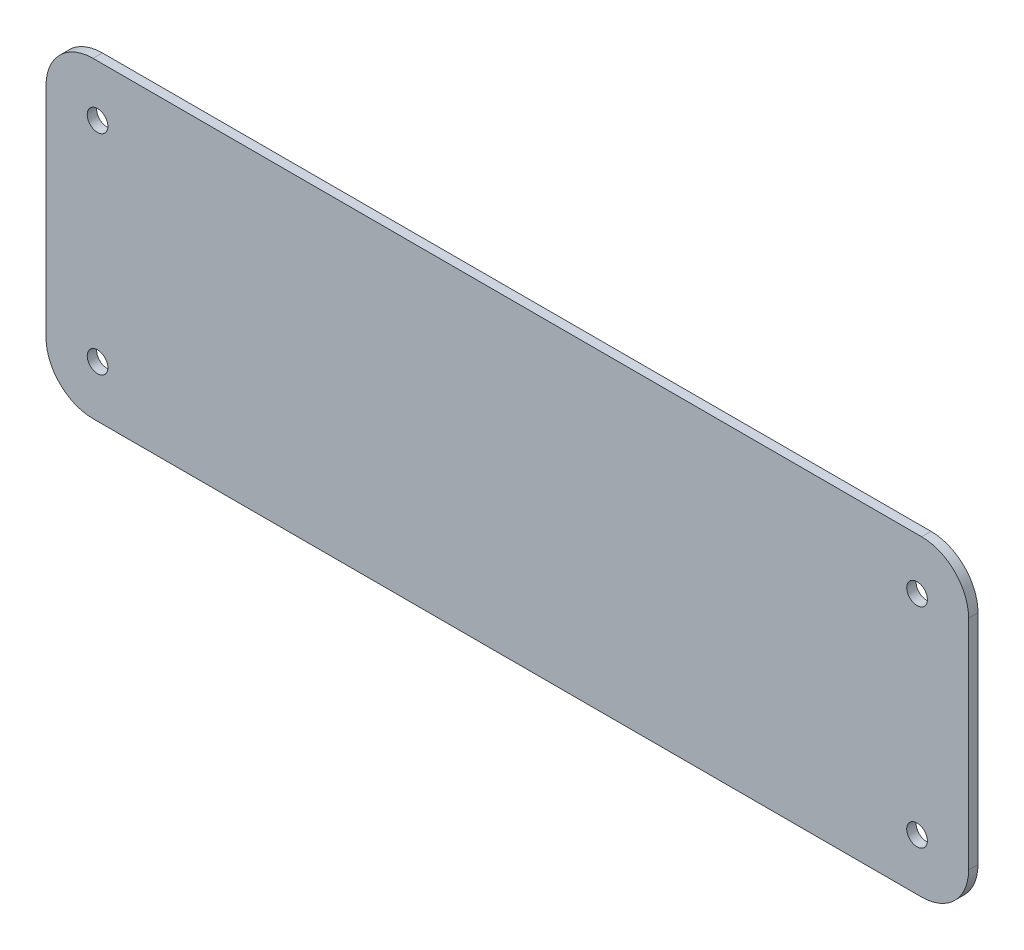
ISO-10303-21;
HEADER;
FILE_DESCRIPTION(('STEP AP214'),'2;1');
FILE_NAME('part.step','',(''),(''),'','','');
FILE_SCHEMA(('AUTOMOTIVE_DESIGN { 1 0 10303 214 1 1 1 1 }'));
ENDSEC;
DATA;
#1=APPLICATION_CONTEXT('core data for automotive mechanical design processes');
#2=APPLICATION_PROTOCOL_DEFINITION('international standard','automotive_design',2000,#1);
#3=PRODUCT_CONTEXT('',#1,'mechanical');
#4=PRODUCT('Part','Part','',(#3));
#5=PRODUCT_RELATED_PRODUCT_CATEGORY('part','',(#4));
#6=PRODUCT_DEFINITION_FORMATION('','',#4);
#7=PRODUCT_DEFINITION_CONTEXT('part definition',#1,'design');
#8=PRODUCT_DEFINITION('design','',#6,#7);
#9=PRODUCT_DEFINITION_SHAPE('','',#8);
#10=(LENGTH_UNIT() NAMED_UNIT(*) SI_UNIT(.MILLI.,.METRE.));
#11=(NAMED_UNIT(*) PLANE_ANGLE_UNIT() SI_UNIT($,.RADIAN.));
#12=(NAMED_UNIT(*) SI_UNIT($,.STERADIAN.) SOLID_ANGLE_UNIT());
#13=UNCERTAINTY_MEASURE_WITH_UNIT(LENGTH_MEASURE(1.E-05),#10,'distance_accuracy_value','');
#14=(GEOMETRIC_REPRESENTATION_CONTEXT(3) GLOBAL_UNCERTAINTY_ASSIGNED_CONTEXT((#13)) GLOBAL_UNIT_ASSIGNED_CONTEXT((#10,
#11,#12)) REPRESENTATION_CONTEXT('',''));
#15=CARTESIAN_POINT('',(0.,0.,0.));
#16=DIRECTION('',(0.,0.,1.));
#17=DIRECTION('',(1.,0.,0.));
#18=AXIS2_PLACEMENT_3D('',#15,#16,#17);
#19=CARTESIAN_POINT('',(92.838694437389,27.864808229616,-8.));
#20=DIRECTION('',(0.,0.,-1.));
#21=DIRECTION('',(-1.,0.,0.));
#22=AXIS2_PLACEMENT_3D('',#19,#20,#21);
#23=PLANE('',#22);
#24=CARTESIAN_POINT('',(5.140210820422,27.377655575311,-8.));
#25=DIRECTION('',(0.,0.,-1.));
#26=DIRECTION('',(-1.,0.,0.));
#27=AXIS2_PLACEMENT_3D('',#24,#25,#26);
#28=CIRCLE('',#27,1.100002540005);
#29=CARTESIAN_POINT('',(4.040208280417,27.377655575311,-8.));
#30=VERTEX_POINT('',#29);
#31=EDGE_CURVE('E194',#30,#30,#28,.T.);
#32=ORIENTED_EDGE('',*,*,#31,.F.);
#33=EDGE_LOOP('',(#32));
#34=FACE_BOUND('',#33,.T.);
#35=CARTESIAN_POINT('',(92.351384302769,27.377498094996,-8.));
#36=DIRECTION('',(0.,0.,-1.));
#37=DIRECTION('',(-1.,0.,0.));
#38=AXIS2_PLACEMENT_3D('',#35,#36,#37);
#39=CIRCLE('',#38,1.10000254000502);
#40=CARTESIAN_POINT('',(91.251381762764,27.377498094996,-8.));
#41=VERTEX_POINT('',#40);
#42=EDGE_CURVE('E140',#41,#41,#39,.T.);
#43=ORIENTED_EDGE('',*,*,#42,.F.);
#44=EDGE_LOOP('',(#43));
#45=FACE_BOUND('',#44,.T.);
#46=DIRECTION('',(1.,0.,0.));
#47=VECTOR('',#46,1.);
#48=CARTESIAN_POINT('',(4.652900685801,32.864808229616,-8.));
#49=LINE('',#48,#47);
#50=CARTESIAN_POINT('',(4.65290068580103,32.864808229616,-8.));
#51=VERTEX_POINT('',#50);
#52=CARTESIAN_POINT('',(92.838694437389,32.864808229616,-8.));
#53=VERTEX_POINT('',#52);
#54=EDGE_CURVE('E151',#51,#53,#49,.T.);
#55=ORIENTED_EDGE('',*,*,#54,.T.);
#56=CARTESIAN_POINT('',(92.838694437389,27.864808229616,-8.));
#57=DIRECTION('',(0.,0.,-1.));
#58=DIRECTION('',(-1.,0.,0.));
#59=AXIS2_PLACEMENT_3D('',#56,#57,#58);
#60=CIRCLE('',#59,5.);
#61=CARTESIAN_POINT('',(97.838694437389,27.864808229616,-8.));
#62=VERTEX_POINT('',#61);
#63=EDGE_CURVE('E99',#53,#62,#60,.T.);
#64=ORIENTED_EDGE('',*,*,#63,.T.);
#65=DIRECTION('',(0.,-1.,0.));
#66=VECTOR('',#65,1.);
#67=CARTESIAN_POINT('',(97.838694437389,27.864808229616,-8.));
#68=LINE('',#67,#66);
#69=CARTESIAN_POINT('',(97.838694437389,4.65351536703104,-8.));
#70=VERTEX_POINT('',#69);
#71=EDGE_CURVE('E166',#62,#70,#68,.T.);
#72=ORIENTED_EDGE('',*,*,#71,.T.);
#73=CARTESIAN_POINT('',(92.838694437389,4.653515367031,-8.));
#74=DIRECTION('',(0.,0.,-1.));
#75=DIRECTION('',(-1.,0.,0.));
#76=AXIS2_PLACEMENT_3D('',#73,#74,#75);
#77=CIRCLE('',#76,5.);
#78=CARTESIAN_POINT('',(92.838694437389,-0.346484632969002,-8.));
#79=VERTEX_POINT('',#78);
#80=EDGE_CURVE('E179',#70,#79,#77,.T.);
#81=ORIENTED_EDGE('',*,*,#80,.T.);
#82=DIRECTION('',(-1.,0.,0.));
#83=VECTOR('',#82,1.);
#84=CARTESIAN_POINT('',(4.652900685801,-0.346484632969001,-8.));
#85=LINE('',#84,#83);
#86=CARTESIAN_POINT('',(4.65290068580104,-0.346484632968999,-8.));
#87=VERTEX_POINT('',#86);
#88=EDGE_CURVE('E118',#79,#87,#85,.T.);
#89=ORIENTED_EDGE('',*,*,#88,.T.);
#90=CARTESIAN_POINT('',(4.652900685801,4.653515367031,-8.));
#91=DIRECTION('',(0.,0.,-1.));
#92=DIRECTION('',(-1.,0.,0.));
#93=AXIS2_PLACEMENT_3D('',#90,#91,#92);
#94=CIRCLE('',#93,5.);
#95=CARTESIAN_POINT('',(-0.347099314199004,4.653515367031,-8.));
#96=VERTEX_POINT('',#95);
#97=EDGE_CURVE('E112',#87,#96,#94,.T.);
#98=ORIENTED_EDGE('',*,*,#97,.T.);
#99=DIRECTION('',(0.,1.,0.));
#100=VECTOR('',#99,1.);
#101=CARTESIAN_POINT('',(-0.347099314199004,27.864808229616,-8.));
#102=LINE('',#101,#100);
#103=CARTESIAN_POINT('',(-0.347099314199005,27.864808229616,-8.));
#104=VERTEX_POINT('',#103);
#105=EDGE_CURVE('E116',#96,#104,#102,.T.);
#106=ORIENTED_EDGE('',*,*,#105,.T.);
#107=CARTESIAN_POINT('',(4.652900685801,27.864808229616,-8.));
#108=DIRECTION('',(0.,0.,-1.));
#109=DIRECTION('',(-1.,0.,0.));
#110=AXIS2_PLACEMENT_3D('',#107,#108,#109);
#111=CIRCLE('',#110,5.);
#112=EDGE_CURVE('E56',#104,#51,#111,.T.);
#113=ORIENTED_EDGE('',*,*,#112,.T.);
#114=EDGE_LOOP('',(#55,#64,#72,#81,#89,#98,#106,#113));
#115=FACE_BOUND('',#114,.T.);
#116=CARTESIAN_POINT('',(92.351384302769,5.140825501651,-8.));
#117=DIRECTION('',(0.,0.,-1.));
#118=DIRECTION('',(-1.,0.,0.));
#119=AXIS2_PLACEMENT_3D('',#116,#117,#118);
#120=CIRCLE('',#119,1.10000254000502);
#121=CARTESIAN_POINT('',(91.251381762764,5.140825501651,-8.));
#122=VERTEX_POINT('',#121);
#123=EDGE_CURVE('E188',#122,#122,#120,.T.);
#124=ORIENTED_EDGE('',*,*,#123,.F.);
#125=EDGE_LOOP('',(#124));
#126=FACE_BOUND('',#125,.T.);
#127=CARTESIAN_POINT('',(5.140210820422,5.140609601219,-8.));
#128=DIRECTION('',(0.,0.,-1.));
#129=DIRECTION('',(-1.,0.,0.));
#130=AXIS2_PLACEMENT_3D('',#127,#128,#129);
#131=CIRCLE('',#130,1.100002540005);
#132=CARTESIAN_POINT('',(4.040208280417,5.140609601219,-8.));
#133=VERTEX_POINT('',#132);
#134=EDGE_CURVE('E200',#133,#133,#131,.T.);
#135=ORIENTED_EDGE('',*,*,#134,.F.);
#136=EDGE_LOOP('',(#135));
#137=FACE_BOUND('',#136,.T.);
#138=ADVANCED_FACE('F39',(#34,#45,#115,#126,#137),#23,.T.);
#139=CARTESIAN_POINT('',(92.838694437389,27.864808229616,-7.));
#140=DIRECTION('',(0.,0.,-1.));
#141=DIRECTION('',(-1.,0.,0.));
#142=AXIS2_PLACEMENT_3D('',#139,#140,#141);
#143=PLANE('',#142);
#144=DIRECTION('',(1.,0.,0.));
#145=VECTOR('',#144,1.);
#146=CARTESIAN_POINT('',(4.652900685801,32.864808229616,-7.));
#147=LINE('',#146,#145);
#148=CARTESIAN_POINT('',(4.65290068580103,32.864808229616,-7.));
#149=VERTEX_POINT('',#148);
#150=CARTESIAN_POINT('',(92.838694437389,32.864808229616,-7.));
#151=VERTEX_POINT('',#150);
#152=EDGE_CURVE('E136',#149,#151,#147,.T.);
#153=ORIENTED_EDGE('',*,*,#152,.F.);
#154=CARTESIAN_POINT('',(4.652900685801,27.864808229616,-7.));
#155=DIRECTION('',(0.,0.,-1.));
#156=DIRECTION('',(-1.,0.,0.));
#157=AXIS2_PLACEMENT_3D('',#154,#155,#156);
#158=CIRCLE('',#157,5.);
#159=CARTESIAN_POINT('',(-0.347099314199005,27.864808229616,-7.));
#160=VERTEX_POINT('',#159);
#161=EDGE_CURVE('E91',#160,#149,#158,.T.);
#162=ORIENTED_EDGE('',*,*,#161,.F.);
#163=DIRECTION('',(0.,1.,0.));
#164=VECTOR('',#163,1.);
#165=CARTESIAN_POINT('',(-0.347099314199004,27.864808229616,-7.));
#166=LINE('',#165,#164);
#167=CARTESIAN_POINT('',(-0.347099314199004,4.653515367031,-7.));
#168=VERTEX_POINT('',#167);
#169=EDGE_CURVE('E85',#168,#160,#166,.T.);
#170=ORIENTED_EDGE('',*,*,#169,.F.);
#171=CARTESIAN_POINT('',(4.652900685801,4.653515367031,-7.));
#172=DIRECTION('',(0.,0.,-1.));
#173=DIRECTION('',(-1.,0.,0.));
#174=AXIS2_PLACEMENT_3D('',#171,#172,#173);
#175=CIRCLE('',#174,5.);
#176=CARTESIAN_POINT('',(4.65290068580104,-0.346484632968999,-7.));
#177=VERTEX_POINT('',#176);
#178=EDGE_CURVE('E126',#177,#168,#175,.T.);
#179=ORIENTED_EDGE('',*,*,#178,.F.);
#180=DIRECTION('',(-1.,0.,0.));
#181=VECTOR('',#180,1.);
#182=CARTESIAN_POINT('',(4.652900685801,-0.346484632969001,-7.));
#183=LINE('',#182,#181);
#184=CARTESIAN_POINT('',(92.838694437389,-0.346484632969002,-7.));
#185=VERTEX_POINT('',#184);
#186=EDGE_CURVE('E146',#185,#177,#183,.T.);
#187=ORIENTED_EDGE('',*,*,#186,.F.);
#188=CARTESIAN_POINT('',(92.838694437389,4.653515367031,-7.));
#189=DIRECTION('',(0.,0.,-1.));
#190=DIRECTION('',(-1.,0.,0.));
#191=AXIS2_PLACEMENT_3D('',#188,#189,#190);
#192=CIRCLE('',#191,5.);
#193=CARTESIAN_POINT('',(97.838694437389,4.65351536703104,-7.));
#194=VERTEX_POINT('',#193);
#195=EDGE_CURVE('E144',#194,#185,#192,.T.);
#196=ORIENTED_EDGE('',*,*,#195,.F.);
#197=DIRECTION('',(0.,-1.,0.));
#198=VECTOR('',#197,1.);
#199=CARTESIAN_POINT('',(97.838694437389,27.864808229616,-7.));
#200=LINE('',#199,#198);
#201=CARTESIAN_POINT('',(97.838694437389,27.864808229616,-7.));
#202=VERTEX_POINT('',#201);
#203=EDGE_CURVE('E142',#202,#194,#200,.T.);
#204=ORIENTED_EDGE('',*,*,#203,.F.);
#205=CARTESIAN_POINT('',(92.838694437389,27.864808229616,-7.));
#206=DIRECTION('',(0.,0.,-1.));
#207=DIRECTION('',(-1.,0.,0.));
#208=AXIS2_PLACEMENT_3D('',#205,#206,#207);
#209=CIRCLE('',#208,5.);
#210=EDGE_CURVE('E139',#151,#202,#209,.T.);
#211=ORIENTED_EDGE('',*,*,#210,.F.);
#212=EDGE_LOOP('',(#153,#162,#170,#179,#187,#196,#204,#211));
#213=FACE_BOUND('',#212,.T.);
#214=CARTESIAN_POINT('',(92.351384302769,27.377498094996,-7.));
#215=DIRECTION('',(0.,0.,-1.));
#216=DIRECTION('',(-1.,0.,0.));
#217=AXIS2_PLACEMENT_3D('',#214,#215,#216);
#218=CIRCLE('',#217,1.10000254000502);
#219=CARTESIAN_POINT('',(91.251381762764,27.377498094996,-7.));
#220=VERTEX_POINT('',#219);
#221=EDGE_CURVE('E185',#220,#220,#218,.T.);
#222=ORIENTED_EDGE('',*,*,#221,.T.);
#223=EDGE_LOOP('',(#222));
#224=FACE_BOUND('',#223,.T.);
#225=CARTESIAN_POINT('',(92.351384302769,5.140825501651,-7.));
#226=DIRECTION('',(0.,0.,-1.));
#227=DIRECTION('',(-1.,0.,0.));
#228=AXIS2_PLACEMENT_3D('',#225,#226,#227);
#229=CIRCLE('',#228,1.10000254000502);
#230=CARTESIAN_POINT('',(91.251381762764,5.140825501651,-7.));
#231=VERTEX_POINT('',#230);
#232=EDGE_CURVE('E191',#231,#231,#229,.T.);
#233=ORIENTED_EDGE('',*,*,#232,.T.);
#234=EDGE_LOOP('',(#233));
#235=FACE_BOUND('',#234,.T.);
#236=CARTESIAN_POINT('',(5.140210820422,27.377655575311,-7.));
#237=DIRECTION('',(0.,0.,-1.));
#238=DIRECTION('',(-1.,0.,0.));
#239=AXIS2_PLACEMENT_3D('',#236,#237,#238);
#240=CIRCLE('',#239,1.100002540005);
#241=CARTESIAN_POINT('',(4.040208280417,27.377655575311,-7.));
#242=VERTEX_POINT('',#241);
#243=EDGE_CURVE('E197',#242,#242,#240,.T.);
#244=ORIENTED_EDGE('',*,*,#243,.T.);
#245=EDGE_LOOP('',(#244));
#246=FACE_BOUND('',#245,.T.);
#247=CARTESIAN_POINT('',(5.140210820422,5.140609601219,-7.));
#248=DIRECTION('',(0.,0.,-1.));
#249=DIRECTION('',(-1.,0.,0.));
#250=AXIS2_PLACEMENT_3D('',#247,#248,#249);
#251=CIRCLE('',#250,1.100002540005);
#252=CARTESIAN_POINT('',(4.040208280417,5.140609601219,-7.));
#253=VERTEX_POINT('',#252);
#254=EDGE_CURVE('E203',#253,#253,#251,.T.);
#255=ORIENTED_EDGE('',*,*,#254,.T.);
#256=EDGE_LOOP('',(#255));
#257=FACE_BOUND('',#256,.T.);
#258=ADVANCED_FACE('F170',(#213,#224,#235,#246,#257),#143,.F.);
#259=CARTESIAN_POINT('',(4.652900685801,32.864808229616,-8.));
#260=DIRECTION('',(0.,-1.,0.));
#261=DIRECTION('',(0.,0.,-1.));
#262=AXIS2_PLACEMENT_3D('',#259,#260,#261);
#263=PLANE('',#262);
#264=ORIENTED_EDGE('',*,*,#152,.T.);
#265=DIRECTION('',(0.,0.,1.));
#266=VECTOR('',#265,1.);
#267=CARTESIAN_POINT('',(92.838694437389,32.864808229616,-8.));
#268=LINE('',#267,#266);
#269=EDGE_CURVE('E11',#53,#151,#268,.T.);
#270=ORIENTED_EDGE('',*,*,#269,.F.);
#271=ORIENTED_EDGE('',*,*,#54,.F.);
#272=DIRECTION('',(0.,0.,1.));
#273=VECTOR('',#272,1.);
#274=CARTESIAN_POINT('',(4.65290068580103,32.864808229616,-8.));
#275=LINE('',#274,#273);
#276=EDGE_CURVE('E132',#51,#149,#275,.T.);
#277=ORIENTED_EDGE('',*,*,#276,.T.);
#278=EDGE_LOOP('',(#264,#270,#271,#277));
#279=FACE_BOUND('',#278,.T.);
#280=ADVANCED_FACE('F41',(#279),#263,.F.);
#281=CARTESIAN_POINT('',(92.838694437389,27.864808229616,-8.));
#282=DIRECTION('',(0.,0.,1.));
#283=DIRECTION('',(1.,0.,0.));
#284=AXIS2_PLACEMENT_3D('',#281,#282,#283);
#285=CYLINDRICAL_SURFACE('',#284,5.);
#286=ORIENTED_EDGE('',*,*,#210,.T.);
#287=DIRECTION('',(0.,0.,1.));
#288=VECTOR('',#287,1.);
#289=CARTESIAN_POINT('',(97.838694437389,27.864808229616,-8.));
#290=LINE('',#289,#288);
#291=EDGE_CURVE('E48',#62,#202,#290,.T.);
#292=ORIENTED_EDGE('',*,*,#291,.F.);
#293=ORIENTED_EDGE('',*,*,#63,.F.);
#294=ORIENTED_EDGE('',*,*,#269,.T.);
#295=EDGE_LOOP('',(#286,#292,#293,#294));
#296=FACE_BOUND('',#295,.T.);
#297=ADVANCED_FACE('F237',(#296),#285,.T.);
#298=CARTESIAN_POINT('',(97.838694437389,27.864808229616,-8.));
#299=DIRECTION('',(-1.,0.,0.));
#300=DIRECTION('',(0.,0.,1.));
#301=AXIS2_PLACEMENT_3D('',#298,#299,#300);
#302=PLANE('',#301);
#303=ORIENTED_EDGE('',*,*,#203,.T.);
#304=DIRECTION('',(0.,0.,1.));
#305=VECTOR('',#304,1.);
#306=CARTESIAN_POINT('',(97.838694437389,4.65351536703104,-8.));
#307=LINE('',#306,#305);
#308=EDGE_CURVE('E158',#70,#194,#307,.T.);
#309=ORIENTED_EDGE('',*,*,#308,.F.);
#310=ORIENTED_EDGE('',*,*,#71,.F.);
#311=ORIENTED_EDGE('',*,*,#291,.T.);
#312=EDGE_LOOP('',(#303,#309,#310,#311));
#313=FACE_BOUND('',#312,.T.);
#314=ADVANCED_FACE('F164',(#313),#302,.F.);
#315=CARTESIAN_POINT('',(92.838694437389,4.653515367031,-8.));
#316=DIRECTION('',(0.,0.,1.));
#317=DIRECTION('',(1.,0.,0.));
#318=AXIS2_PLACEMENT_3D('',#315,#316,#317);
#319=CYLINDRICAL_SURFACE('',#318,5.);
#320=ORIENTED_EDGE('',*,*,#195,.T.);
#321=DIRECTION('',(0.,0.,1.));
#322=VECTOR('',#321,1.);
#323=CARTESIAN_POINT('',(92.838694437389,-0.346484632969002,-8.));
#324=LINE('',#323,#322);
#325=EDGE_CURVE('E155',#79,#185,#324,.T.);
#326=ORIENTED_EDGE('',*,*,#325,.F.);
#327=ORIENTED_EDGE('',*,*,#80,.F.);
#328=ORIENTED_EDGE('',*,*,#308,.T.);
#329=EDGE_LOOP('',(#320,#326,#327,#328));
#330=FACE_BOUND('',#329,.T.);
#331=ADVANCED_FACE('F175',(#330),#319,.T.);
#332=CARTESIAN_POINT('',(4.652900685801,-0.346484632969001,-8.));
#333=DIRECTION('',(0.,1.,0.));
#334=DIRECTION('',(-1.,0.,0.));
#335=AXIS2_PLACEMENT_3D('',#332,#333,#334);
#336=PLANE('',#335);
#337=ORIENTED_EDGE('',*,*,#186,.T.);
#338=DIRECTION('',(0.,0.,1.));
#339=VECTOR('',#338,1.);
#340=CARTESIAN_POINT('',(4.65290068580104,-0.346484632968999,-8.));
#341=LINE('',#340,#339);
#342=EDGE_CURVE('E127',#87,#177,#341,.T.);
#343=ORIENTED_EDGE('',*,*,#342,.F.);
#344=ORIENTED_EDGE('',*,*,#88,.F.);
#345=ORIENTED_EDGE('',*,*,#325,.T.);
#346=EDGE_LOOP('',(#337,#343,#344,#345));
#347=FACE_BOUND('',#346,.T.);
#348=ADVANCED_FACE('F178',(#347),#336,.F.);
#349=CARTESIAN_POINT('',(4.652900685801,4.653515367031,-8.));
#350=DIRECTION('',(0.,0.,1.));
#351=DIRECTION('',(1.,0.,0.));
#352=AXIS2_PLACEMENT_3D('',#349,#350,#351);
#353=CYLINDRICAL_SURFACE('',#352,5.);
#354=ORIENTED_EDGE('',*,*,#178,.T.);
#355=DIRECTION('',(0.,0.,1.));
#356=VECTOR('',#355,1.);
#357=CARTESIAN_POINT('',(-0.347099314199004,4.653515367031,-8.));
#358=LINE('',#357,#356);
#359=EDGE_CURVE('E123',#96,#168,#358,.T.);
#360=ORIENTED_EDGE('',*,*,#359,.F.);
#361=ORIENTED_EDGE('',*,*,#97,.F.);
#362=ORIENTED_EDGE('',*,*,#342,.T.);
#363=EDGE_LOOP('',(#354,#360,#361,#362));
#364=FACE_BOUND('',#363,.T.);
#365=ADVANCED_FACE('F124',(#364),#353,.T.);
#366=CARTESIAN_POINT('',(-0.347099314199004,27.864808229616,-8.));
#367=DIRECTION('',(1.,0.,0.));
#368=DIRECTION('',(0.,0.,-1.));
#369=AXIS2_PLACEMENT_3D('',#366,#367,#368);
#370=PLANE('',#369);
#371=ORIENTED_EDGE('',*,*,#169,.T.);
#372=DIRECTION('',(0.,0.,1.));
#373=VECTOR('',#372,1.);
#374=CARTESIAN_POINT('',(-0.347099314199005,27.864808229616,-8.));
#375=LINE('',#374,#373);
#376=EDGE_CURVE('E128',#104,#160,#375,.T.);
#377=ORIENTED_EDGE('',*,*,#376,.F.);
#378=ORIENTED_EDGE('',*,*,#105,.F.);
#379=ORIENTED_EDGE('',*,*,#359,.T.);
#380=EDGE_LOOP('',(#371,#377,#378,#379));
#381=FACE_BOUND('',#380,.T.);
#382=ADVANCED_FACE('F130',(#381),#370,.F.);
#383=CARTESIAN_POINT('',(4.652900685801,27.864808229616,-8.));
#384=DIRECTION('',(0.,0.,1.));
#385=DIRECTION('',(1.,0.,0.));
#386=AXIS2_PLACEMENT_3D('',#383,#384,#385);
#387=CYLINDRICAL_SURFACE('',#386,5.);
#388=ORIENTED_EDGE('',*,*,#161,.T.);
#389=ORIENTED_EDGE('',*,*,#276,.F.);
#390=ORIENTED_EDGE('',*,*,#112,.F.);
#391=ORIENTED_EDGE('',*,*,#376,.T.);
#392=EDGE_LOOP('',(#388,#389,#390,#391));
#393=FACE_BOUND('',#392,.T.);
#394=ADVANCED_FACE('F225',(#393),#387,.T.);
#395=CARTESIAN_POINT('',(92.351384302769,27.377498094996,-8.));
#396=DIRECTION('',(0.,0.,1.));
#397=DIRECTION('',(1.,0.,0.));
#398=AXIS2_PLACEMENT_3D('',#395,#396,#397);
#399=CYLINDRICAL_SURFACE('',#398,1.10000254000502);
#400=ORIENTED_EDGE('',*,*,#42,.T.);
#401=EDGE_LOOP('',(#400));
#402=FACE_BOUND('',#401,.T.);
#403=ORIENTED_EDGE('',*,*,#221,.F.);
#404=EDGE_LOOP('',(#403));
#405=FACE_BOUND('',#404,.T.);
#406=ADVANCED_FACE('F222',(#402,#405),#399,.F.);
#407=CARTESIAN_POINT('',(92.351384302769,5.140825501651,-8.));
#408=DIRECTION('',(0.,0.,1.));
#409=DIRECTION('',(1.,0.,0.));
#410=AXIS2_PLACEMENT_3D('',#407,#408,#409);
#411=CYLINDRICAL_SURFACE('',#410,1.10000254000502);
#412=ORIENTED_EDGE('',*,*,#123,.T.);
#413=EDGE_LOOP('',(#412));
#414=FACE_BOUND('',#413,.T.);
#415=ORIENTED_EDGE('',*,*,#232,.F.);
#416=EDGE_LOOP('',(#415));
#417=FACE_BOUND('',#416,.T.);
#418=ADVANCED_FACE('F313',(#414,#417),#411,.F.);
#419=CARTESIAN_POINT('',(5.140210820422,27.377655575311,-8.));
#420=DIRECTION('',(0.,0.,1.));
#421=DIRECTION('',(1.,0.,0.));
#422=AXIS2_PLACEMENT_3D('',#419,#420,#421);
#423=CYLINDRICAL_SURFACE('',#422,1.100002540005);
#424=ORIENTED_EDGE('',*,*,#31,.T.);
#425=EDGE_LOOP('',(#424));
#426=FACE_BOUND('',#425,.T.);
#427=ORIENTED_EDGE('',*,*,#243,.F.);
#428=EDGE_LOOP('',(#427));
#429=FACE_BOUND('',#428,.T.);
#430=ADVANCED_FACE('F322',(#426,#429),#423,.F.);
#431=CARTESIAN_POINT('',(5.140210820422,5.140609601219,-8.));
#432=DIRECTION('',(0.,0.,1.));
#433=DIRECTION('',(1.,0.,0.));
#434=AXIS2_PLACEMENT_3D('',#431,#432,#433);
#435=CYLINDRICAL_SURFACE('',#434,1.100002540005);
#436=ORIENTED_EDGE('',*,*,#134,.T.);
#437=EDGE_LOOP('',(#436));
#438=FACE_BOUND('',#437,.T.);
#439=ORIENTED_EDGE('',*,*,#254,.F.);
#440=EDGE_LOOP('',(#439));
#441=FACE_BOUND('',#440,.T.);
#442=ADVANCED_FACE('F209',(#438,#441),#435,.F.);
#443=CLOSED_SHELL('',(#138,#258,#280,#297,#314,#331,#348,#365,#382,#394,#406,#418,#430,#442));
#444=MANIFOLD_SOLID_BREP('B2',#443);
#445=ADVANCED_BREP_SHAPE_REPRESENTATION('',(#18,#444),#14);
#446=SHAPE_DEFINITION_REPRESENTATION(#9,#445);
ENDSEC;
END-ISO-10303-21;
